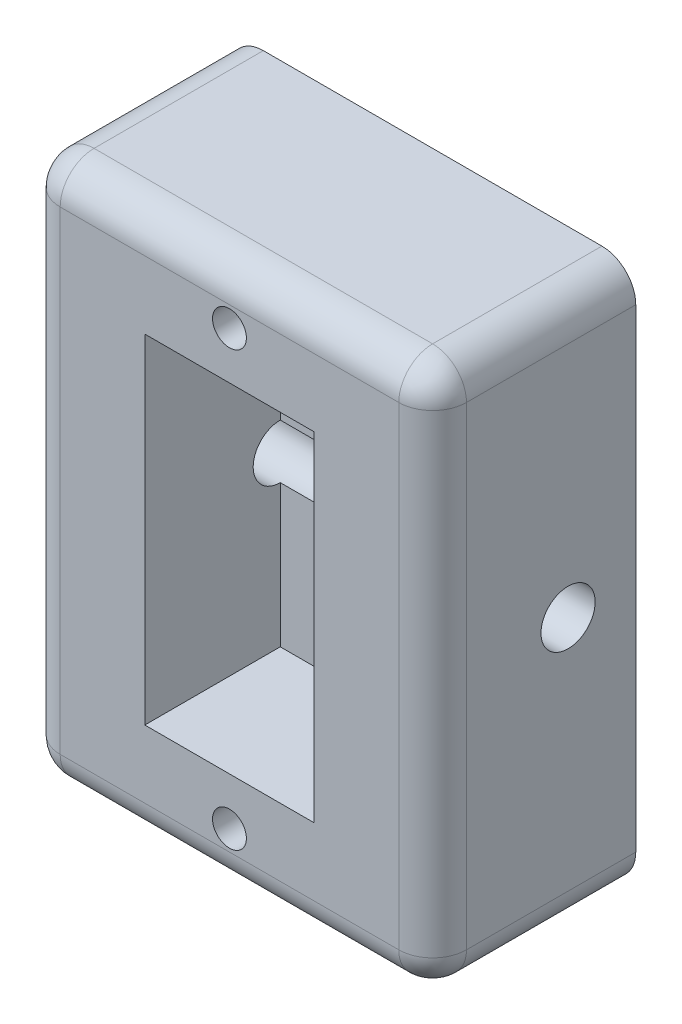
ISO-10303-21;
HEADER;
FILE_DESCRIPTION(('STEP AP214'),'2;1');
FILE_NAME('part.step','',(''),(''),'','','');
FILE_SCHEMA(('AUTOMOTIVE_DESIGN { 1 0 10303 214 1 1 1 1 }'));
ENDSEC;
DATA;
#1=APPLICATION_CONTEXT('core data for automotive mechanical design processes');
#2=APPLICATION_PROTOCOL_DEFINITION('international standard','automotive_design',2000,#1);
#3=PRODUCT_CONTEXT('',#1,'mechanical');
#4=PRODUCT('Part','Part','',(#3));
#5=PRODUCT_RELATED_PRODUCT_CATEGORY('part','',(#4));
#6=PRODUCT_DEFINITION_FORMATION('','',#4);
#7=PRODUCT_DEFINITION_CONTEXT('part definition',#1,'design');
#8=PRODUCT_DEFINITION('design','',#6,#7);
#9=PRODUCT_DEFINITION_SHAPE('','',#8);
#10=(LENGTH_UNIT() NAMED_UNIT(*) SI_UNIT(.MILLI.,.METRE.));
#11=(NAMED_UNIT(*) PLANE_ANGLE_UNIT() SI_UNIT($,.RADIAN.));
#12=(NAMED_UNIT(*) SI_UNIT($,.STERADIAN.) SOLID_ANGLE_UNIT());
#13=UNCERTAINTY_MEASURE_WITH_UNIT(LENGTH_MEASURE(1.E-05),#10,'distance_accuracy_value','');
#14=(GEOMETRIC_REPRESENTATION_CONTEXT(3) GLOBAL_UNCERTAINTY_ASSIGNED_CONTEXT((#13)) GLOBAL_UNIT_ASSIGNED_CONTEXT((#10,
#11,#12)) REPRESENTATION_CONTEXT('',''));
#15=CARTESIAN_POINT('',(0.,0.,0.));
#16=DIRECTION('',(0.,0.,1.));
#17=DIRECTION('',(1.,0.,0.));
#18=AXIS2_PLACEMENT_3D('',#15,#16,#17);
#19=CARTESIAN_POINT('',(0.,0.,-20.));
#20=DIRECTION('',(0.,0.,-1.));
#21=DIRECTION('',(-1.,0.,0.));
#22=AXIS2_PLACEMENT_3D('',#19,#20,#21);
#23=PLANE('',#22);
#24=DIRECTION('',(0.,-1.,0.));
#25=VECTOR('',#24,1.);
#26=CARTESIAN_POINT('',(-12.5,-25.,-20.));
#27=LINE('',#26,#25);
#28=CARTESIAN_POINT('',(-12.5,25.,-20.));
#29=VERTEX_POINT('',#28);
#30=CARTESIAN_POINT('',(-12.5,4.,-20.));
#31=VERTEX_POINT('',#30);
#32=EDGE_CURVE('E187',#29,#31,#27,.T.);
#33=ORIENTED_EDGE('',*,*,#32,.T.);
#34=DIRECTION('',(1.,0.,0.));
#35=VECTOR('',#34,1.);
#36=CARTESIAN_POINT('',(-30.,4.,-20.));
#37=LINE('',#36,#35);
#38=CARTESIAN_POINT('',(12.5,4.,-20.));
#39=VERTEX_POINT('',#38);
#40=EDGE_CURVE('E163',#31,#39,#37,.T.);
#41=ORIENTED_EDGE('',*,*,#40,.T.);
#42=DIRECTION('',(0.,1.,0.));
#43=VECTOR('',#42,1.);
#44=CARTESIAN_POINT('',(12.5,-25.,-20.));
#45=LINE('',#44,#43);
#46=CARTESIAN_POINT('',(12.5,25.,-20.));
#47=VERTEX_POINT('',#46);
#48=EDGE_CURVE('E173',#39,#47,#45,.T.);
#49=ORIENTED_EDGE('',*,*,#48,.T.);
#50=DIRECTION('',(-1.,0.,0.));
#51=VECTOR('',#50,1.);
#52=CARTESIAN_POINT('',(-12.5,25.,-20.));
#53=LINE('',#52,#51);
#54=EDGE_CURVE('E179',#47,#29,#53,.T.);
#55=ORIENTED_EDGE('',*,*,#54,.T.);
#56=EDGE_LOOP('',(#33,#41,#49,#55));
#57=FACE_BOUND('',#56,.T.);
#58=ADVANCED_FACE('F41',(#57),#23,.F.);
#59=CARTESIAN_POINT('',(30.,-40.,-30.));
#60=DIRECTION('',(1.,0.,0.));
#61=DIRECTION('',(0.,0.,-1.));
#62=AXIS2_PLACEMENT_3D('',#59,#60,#61);
#63=PLANE('',#62);
#64=DIRECTION('',(0.,1.,0.));
#65=VECTOR('',#64,1.);
#66=CARTESIAN_POINT('',(30.,-40.,-30.));
#67=LINE('',#66,#65);
#68=CARTESIAN_POINT('',(30.,-35.,-30.));
#69=VERTEX_POINT('',#68);
#70=CARTESIAN_POINT('',(30.,35.,-30.));
#71=VERTEX_POINT('',#70);
#72=EDGE_CURVE('E203',#69,#71,#67,.T.);
#73=ORIENTED_EDGE('',*,*,#72,.T.);
#74=DIRECTION('',(0.,0.,1.));
#75=VECTOR('',#74,1.);
#76=CARTESIAN_POINT('',(30.,35.,-30.));
#77=LINE('',#76,#75);
#78=CARTESIAN_POINT('',(30.,35.,-5.));
#79=VERTEX_POINT('',#78);
#80=EDGE_CURVE('E233',#71,#79,#77,.T.);
#81=ORIENTED_EDGE('',*,*,#80,.T.);
#82=DIRECTION('',(0.,1.,0.));
#83=VECTOR('',#82,1.);
#84=CARTESIAN_POINT('',(30.,-40.,-5.));
#85=LINE('',#84,#83);
#86=CARTESIAN_POINT('',(30.,-35.,-5.));
#87=VERTEX_POINT('',#86);
#88=EDGE_CURVE('E221',#79,#87,#85,.F.);
#89=ORIENTED_EDGE('',*,*,#88,.T.);
#90=DIRECTION('',(0.,0.,1.));
#91=VECTOR('',#90,1.);
#92=CARTESIAN_POINT('',(30.,-35.,-30.));
#93=LINE('',#92,#91);
#94=EDGE_CURVE('E231',#87,#69,#93,.F.);
#95=ORIENTED_EDGE('',*,*,#94,.T.);
#96=EDGE_LOOP('',(#73,#81,#89,#95));
#97=FACE_BOUND('',#96,.T.);
#98=CARTESIAN_POINT('',(30.,0.,-20.));
#99=DIRECTION('',(1.,0.,0.));
#100=DIRECTION('',(0.,0.,-1.));
#101=AXIS2_PLACEMENT_3D('',#98,#99,#100);
#102=CIRCLE('',#101,4.);
#103=CARTESIAN_POINT('',(30.,0.,-24.));
#104=VERTEX_POINT('',#103);
#105=EDGE_CURVE('E229',#104,#104,#102,.T.);
#106=ORIENTED_EDGE('',*,*,#105,.F.);
#107=EDGE_LOOP('',(#106));
#108=FACE_BOUND('',#107,.T.);
#109=ADVANCED_FACE('F343',(#97,#108),#63,.T.);
#110=CARTESIAN_POINT('',(-30.,-40.,-30.));
#111=DIRECTION('',(0.,-1.,0.));
#112=DIRECTION('',(1.,0.,0.));
#113=AXIS2_PLACEMENT_3D('',#110,#111,#112);
#114=PLANE('',#113);
#115=DIRECTION('',(1.,0.,0.));
#116=VECTOR('',#115,1.);
#117=CARTESIAN_POINT('',(-30.,-40.,-5.));
#118=LINE('',#117,#116);
#119=CARTESIAN_POINT('',(25.,-40.,-5.));
#120=VERTEX_POINT('',#119);
#121=CARTESIAN_POINT('',(-25.,-40.,-5.));
#122=VERTEX_POINT('',#121);
#123=EDGE_CURVE('E256',#120,#122,#118,.F.);
#124=ORIENTED_EDGE('',*,*,#123,.T.);
#125=DIRECTION('',(0.,0.,1.));
#126=VECTOR('',#125,1.);
#127=CARTESIAN_POINT('',(-25.,-40.,-30.));
#128=LINE('',#127,#126);
#129=CARTESIAN_POINT('',(-25.,-40.,-30.));
#130=VERTEX_POINT('',#129);
#131=EDGE_CURVE('E260',#122,#130,#128,.F.);
#132=ORIENTED_EDGE('',*,*,#131,.T.);
#133=DIRECTION('',(1.,0.,0.));
#134=VECTOR('',#133,1.);
#135=CARTESIAN_POINT('',(-30.,-40.,-30.));
#136=LINE('',#135,#134);
#137=CARTESIAN_POINT('',(25.,-40.,-30.));
#138=VERTEX_POINT('',#137);
#139=EDGE_CURVE('E164',#130,#138,#136,.T.);
#140=ORIENTED_EDGE('',*,*,#139,.T.);
#141=DIRECTION('',(0.,0.,1.));
#142=VECTOR('',#141,1.);
#143=CARTESIAN_POINT('',(25.,-40.,-30.));
#144=LINE('',#143,#142);
#145=EDGE_CURVE('E258',#138,#120,#144,.T.);
#146=ORIENTED_EDGE('',*,*,#145,.T.);
#147=EDGE_LOOP('',(#124,#132,#140,#146));
#148=FACE_BOUND('',#147,.T.);
#149=ADVANCED_FACE('F347',(#148),#114,.T.);
#150=CARTESIAN_POINT('',(-30.,-40.,-30.));
#151=DIRECTION('',(-1.,0.,0.));
#152=DIRECTION('',(0.,0.,1.));
#153=AXIS2_PLACEMENT_3D('',#150,#151,#152);
#154=PLANE('',#153);
#155=CARTESIAN_POINT('',(-30.,0.,-20.));
#156=DIRECTION('',(1.,0.,0.));
#157=DIRECTION('',(0.,0.,-1.));
#158=AXIS2_PLACEMENT_3D('',#155,#156,#157);
#159=CIRCLE('',#158,4.);
#160=CARTESIAN_POINT('',(-30.,0.,-24.));
#161=VERTEX_POINT('',#160);
#162=EDGE_CURVE('E314',#161,#161,#159,.T.);
#163=ORIENTED_EDGE('',*,*,#162,.T.);
#164=EDGE_LOOP('',(#163));
#165=FACE_BOUND('',#164,.T.);
#166=DIRECTION('',(0.,-1.,0.));
#167=VECTOR('',#166,1.);
#168=CARTESIAN_POINT('',(-30.,40.,-5.));
#169=LINE('',#168,#167);
#170=CARTESIAN_POINT('',(-30.,-35.,-5.));
#171=VERTEX_POINT('',#170);
#172=CARTESIAN_POINT('',(-30.,35.,-5.));
#173=VERTEX_POINT('',#172);
#174=EDGE_CURVE('E250',#171,#173,#169,.F.);
#175=ORIENTED_EDGE('',*,*,#174,.T.);
#176=DIRECTION('',(0.,0.,1.));
#177=VECTOR('',#176,1.);
#178=CARTESIAN_POINT('',(-30.,35.,-30.));
#179=LINE('',#178,#177);
#180=CARTESIAN_POINT('',(-30.,35.,-30.));
#181=VERTEX_POINT('',#180);
#182=EDGE_CURVE('E254',#173,#181,#179,.F.);
#183=ORIENTED_EDGE('',*,*,#182,.T.);
#184=DIRECTION('',(0.,-1.,0.));
#185=VECTOR('',#184,1.);
#186=CARTESIAN_POINT('',(-30.,-40.,-30.));
#187=LINE('',#186,#185);
#188=CARTESIAN_POINT('',(-30.,-35.,-30.));
#189=VERTEX_POINT('',#188);
#190=EDGE_CURVE('E215',#181,#189,#187,.T.);
#191=ORIENTED_EDGE('',*,*,#190,.T.);
#192=DIRECTION('',(0.,0.,1.));
#193=VECTOR('',#192,1.);
#194=CARTESIAN_POINT('',(-30.,-35.,-30.));
#195=LINE('',#194,#193);
#196=EDGE_CURVE('E252',#189,#171,#195,.T.);
#197=ORIENTED_EDGE('',*,*,#196,.T.);
#198=EDGE_LOOP('',(#175,#183,#191,#197));
#199=FACE_BOUND('',#198,.T.);
#200=ADVANCED_FACE('F370',(#165,#199),#154,.T.);
#201=CARTESIAN_POINT('',(-30.,40.,-30.));
#202=DIRECTION('',(0.,1.,0.));
#203=DIRECTION('',(0.,0.,1.));
#204=AXIS2_PLACEMENT_3D('',#201,#202,#203);
#205=PLANE('',#204);
#206=DIRECTION('',(-1.,0.,0.));
#207=VECTOR('',#206,1.);
#208=CARTESIAN_POINT('',(30.,40.,-5.));
#209=LINE('',#208,#207);
#210=CARTESIAN_POINT('',(-25.,40.,-5.));
#211=VERTEX_POINT('',#210);
#212=CARTESIAN_POINT('',(25.,40.,-5.));
#213=VERTEX_POINT('',#212);
#214=EDGE_CURVE('E236',#211,#213,#209,.F.);
#215=ORIENTED_EDGE('',*,*,#214,.T.);
#216=DIRECTION('',(0.,0.,1.));
#217=VECTOR('',#216,1.);
#218=CARTESIAN_POINT('',(25.,40.,-30.));
#219=LINE('',#218,#217);
#220=CARTESIAN_POINT('',(25.,40.,-30.));
#221=VERTEX_POINT('',#220);
#222=EDGE_CURVE('E240',#213,#221,#219,.F.);
#223=ORIENTED_EDGE('',*,*,#222,.T.);
#224=DIRECTION('',(-1.,0.,0.));
#225=VECTOR('',#224,1.);
#226=CARTESIAN_POINT('',(-30.,40.,-30.));
#227=LINE('',#226,#225);
#228=CARTESIAN_POINT('',(-25.,40.,-30.));
#229=VERTEX_POINT('',#228);
#230=EDGE_CURVE('E212',#221,#229,#227,.T.);
#231=ORIENTED_EDGE('',*,*,#230,.T.);
#232=DIRECTION('',(0.,0.,1.));
#233=VECTOR('',#232,1.);
#234=CARTESIAN_POINT('',(-25.,40.,-30.));
#235=LINE('',#234,#233);
#236=EDGE_CURVE('E238',#229,#211,#235,.T.);
#237=ORIENTED_EDGE('',*,*,#236,.T.);
#238=EDGE_LOOP('',(#215,#223,#231,#237));
#239=FACE_BOUND('',#238,.T.);
#240=ADVANCED_FACE('F364',(#239),#205,.T.);
#241=CARTESIAN_POINT('',(0.,0.,-30.));
#242=DIRECTION('',(0.,0.,-1.));
#243=DIRECTION('',(-1.,0.,0.));
#244=AXIS2_PLACEMENT_3D('',#241,#242,#243);
#245=PLANE('',#244);
#246=ORIENTED_EDGE('',*,*,#230,.F.);
#247=CARTESIAN_POINT('',(25.,35.,-30.));
#248=DIRECTION('',(0.,0.,-1.));
#249=DIRECTION('',(-1.,0.,0.));
#250=AXIS2_PLACEMENT_3D('',#247,#248,#249);
#251=CIRCLE('',#250,5.);
#252=EDGE_CURVE('E248',#221,#71,#251,.T.);
#253=ORIENTED_EDGE('',*,*,#252,.T.);
#254=ORIENTED_EDGE('',*,*,#72,.F.);
#255=CARTESIAN_POINT('',(25.,-35.,-30.));
#256=DIRECTION('',(0.,0.,-1.));
#257=DIRECTION('',(-1.,0.,0.));
#258=AXIS2_PLACEMENT_3D('',#255,#256,#257);
#259=CIRCLE('',#258,5.);
#260=EDGE_CURVE('E242',#69,#138,#259,.T.);
#261=ORIENTED_EDGE('',*,*,#260,.T.);
#262=ORIENTED_EDGE('',*,*,#139,.F.);
#263=CARTESIAN_POINT('',(-25.,-35.,-30.));
#264=DIRECTION('',(0.,0.,-1.));
#265=DIRECTION('',(-1.,0.,0.));
#266=AXIS2_PLACEMENT_3D('',#263,#264,#265);
#267=CIRCLE('',#266,5.);
#268=EDGE_CURVE('E244',#130,#189,#267,.T.);
#269=ORIENTED_EDGE('',*,*,#268,.T.);
#270=ORIENTED_EDGE('',*,*,#190,.F.);
#271=CARTESIAN_POINT('',(-25.,35.,-30.));
#272=DIRECTION('',(0.,0.,-1.));
#273=DIRECTION('',(-1.,0.,0.));
#274=AXIS2_PLACEMENT_3D('',#271,#272,#273);
#275=CIRCLE('',#274,5.);
#276=EDGE_CURVE('E246',#181,#229,#275,.T.);
#277=ORIENTED_EDGE('',*,*,#276,.T.);
#278=EDGE_LOOP('',(#246,#253,#254,#261,#262,#269,#270,#277));
#279=FACE_BOUND('',#278,.T.);
#280=ADVANCED_FACE('F361',(#279),#245,.T.);
#281=CARTESIAN_POINT('',(0.,0.,0.));
#282=DIRECTION('',(0.,0.,-1.));
#283=DIRECTION('',(-1.,0.,0.));
#284=AXIS2_PLACEMENT_3D('',#281,#282,#283);
#285=PLANE('',#284);
#286=DIRECTION('',(0.,-1.,0.));
#287=VECTOR('',#286,1.);
#288=CARTESIAN_POINT('',(-25.,-40.,0.));
#289=LINE('',#288,#287);
#290=CARTESIAN_POINT('',(-25.,35.,0.));
#291=VERTEX_POINT('',#290);
#292=CARTESIAN_POINT('',(-25.,-35.,0.));
#293=VERTEX_POINT('',#292);
#294=EDGE_CURVE('E262',#291,#293,#289,.T.);
#295=ORIENTED_EDGE('',*,*,#294,.T.);
#296=DIRECTION('',(1.,0.,0.));
#297=VECTOR('',#296,1.);
#298=CARTESIAN_POINT('',(30.,-35.,0.));
#299=LINE('',#298,#297);
#300=CARTESIAN_POINT('',(25.,-35.,0.));
#301=VERTEX_POINT('',#300);
#302=EDGE_CURVE('E11',#293,#301,#299,.T.);
#303=ORIENTED_EDGE('',*,*,#302,.T.);
#304=DIRECTION('',(0.,1.,0.));
#305=VECTOR('',#304,1.);
#306=CARTESIAN_POINT('',(25.,40.,0.));
#307=LINE('',#306,#305);
#308=CARTESIAN_POINT('',(25.,35.,0.));
#309=VERTEX_POINT('',#308);
#310=EDGE_CURVE('E50',#301,#309,#307,.T.);
#311=ORIENTED_EDGE('',*,*,#310,.T.);
#312=DIRECTION('',(-1.,0.,0.));
#313=VECTOR('',#312,1.);
#314=CARTESIAN_POINT('',(-30.,35.,0.));
#315=LINE('',#314,#313);
#316=EDGE_CURVE('E264',#309,#291,#315,.T.);
#317=ORIENTED_EDGE('',*,*,#316,.T.);
#318=EDGE_LOOP('',(#295,#303,#311,#317));
#319=FACE_BOUND('',#318,.T.);
#320=CARTESIAN_POINT('',(0.,32.,0.));
#321=DIRECTION('',(0.,0.,-1.));
#322=DIRECTION('',(-1.,0.,0.));
#323=AXIS2_PLACEMENT_3D('',#320,#321,#322);
#324=CIRCLE('',#323,2.5);
#325=CARTESIAN_POINT('',(-2.5,32.,0.));
#326=VERTEX_POINT('',#325);
#327=EDGE_CURVE('E225',#326,#326,#324,.F.);
#328=ORIENTED_EDGE('',*,*,#327,.F.);
#329=EDGE_LOOP('',(#328));
#330=FACE_BOUND('',#329,.T.);
#331=CARTESIAN_POINT('',(0.,-32.,0.));
#332=DIRECTION('',(0.,0.,-1.));
#333=DIRECTION('',(-1.,0.,0.));
#334=AXIS2_PLACEMENT_3D('',#331,#332,#333);
#335=CIRCLE('',#334,2.5);
#336=CARTESIAN_POINT('',(-2.5,-32.,0.));
#337=VERTEX_POINT('',#336);
#338=EDGE_CURVE('E222',#337,#337,#335,.F.);
#339=ORIENTED_EDGE('',*,*,#338,.F.);
#340=EDGE_LOOP('',(#339));
#341=FACE_BOUND('',#340,.T.);
#342=DIRECTION('',(-1.,0.,0.));
#343=VECTOR('',#342,1.);
#344=CARTESIAN_POINT('',(-12.5,25.,0.));
#345=LINE('',#344,#343);
#346=CARTESIAN_POINT('',(12.5,25.,0.));
#347=VERTEX_POINT('',#346);
#348=CARTESIAN_POINT('',(-12.5,25.,0.));
#349=VERTEX_POINT('',#348);
#350=EDGE_CURVE('E193',#347,#349,#345,.T.);
#351=ORIENTED_EDGE('',*,*,#350,.F.);
#352=DIRECTION('',(0.,1.,0.));
#353=VECTOR('',#352,1.);
#354=CARTESIAN_POINT('',(12.5,-25.,0.));
#355=LINE('',#354,#353);
#356=CARTESIAN_POINT('',(12.5,-25.,0.));
#357=VERTEX_POINT('',#356);
#358=EDGE_CURVE('E174',#357,#347,#355,.T.);
#359=ORIENTED_EDGE('',*,*,#358,.F.);
#360=DIRECTION('',(1.,0.,0.));
#361=VECTOR('',#360,1.);
#362=CARTESIAN_POINT('',(-12.5,-25.,0.));
#363=LINE('',#362,#361);
#364=CARTESIAN_POINT('',(-12.5,-25.,0.));
#365=VERTEX_POINT('',#364);
#366=EDGE_CURVE('E184',#365,#357,#363,.T.);
#367=ORIENTED_EDGE('',*,*,#366,.F.);
#368=DIRECTION('',(0.,-1.,0.));
#369=VECTOR('',#368,1.);
#370=CARTESIAN_POINT('',(-12.5,-25.,0.));
#371=LINE('',#370,#369);
#372=EDGE_CURVE('E196',#349,#365,#371,.T.);
#373=ORIENTED_EDGE('',*,*,#372,.F.);
#374=EDGE_LOOP('',(#351,#359,#367,#373));
#375=FACE_BOUND('',#374,.T.);
#376=ADVANCED_FACE('F329',(#319,#330,#341,#375),#285,.F.);
#377=CARTESIAN_POINT('',(12.5,-25.,-20.));
#378=DIRECTION('',(1.,0.,0.));
#379=DIRECTION('',(0.,0.,-1.));
#380=AXIS2_PLACEMENT_3D('',#377,#378,#379);
#381=PLANE('',#380);
#382=ORIENTED_EDGE('',*,*,#48,.F.);
#383=CARTESIAN_POINT('',(12.5,0.,-20.));
#384=DIRECTION('',(1.,0.,0.));
#385=DIRECTION('',(0.,0.,-1.));
#386=AXIS2_PLACEMENT_3D('',#383,#384,#385);
#387=CIRCLE('',#386,4.);
#388=CARTESIAN_POINT('',(12.5,-3.99999999999999,-20.));
#389=VERTEX_POINT('',#388);
#390=EDGE_CURVE('E156',#39,#389,#387,.T.);
#391=ORIENTED_EDGE('',*,*,#390,.T.);
#392=CARTESIAN_POINT('',(12.5,-25.,-20.));
#393=VERTEX_POINT('',#392);
#394=EDGE_CURVE('E170',#393,#389,#45,.T.);
#395=ORIENTED_EDGE('',*,*,#394,.F.);
#396=DIRECTION('',(0.,0.,1.));
#397=VECTOR('',#396,1.);
#398=CARTESIAN_POINT('',(12.5,-25.,-20.));
#399=LINE('',#398,#397);
#400=EDGE_CURVE('E201',#393,#357,#399,.T.);
#401=ORIENTED_EDGE('',*,*,#400,.T.);
#402=ORIENTED_EDGE('',*,*,#358,.T.);
#403=DIRECTION('',(0.,0.,1.));
#404=VECTOR('',#403,1.);
#405=CARTESIAN_POINT('',(12.5,25.,-20.));
#406=LINE('',#405,#404);
#407=EDGE_CURVE('E191',#47,#347,#406,.T.);
#408=ORIENTED_EDGE('',*,*,#407,.F.);
#409=EDGE_LOOP('',(#382,#391,#395,#401,#402,#408));
#410=FACE_BOUND('',#409,.T.);
#411=ADVANCED_FACE('F169',(#410),#381,.F.);
#412=CARTESIAN_POINT('',(-12.5,-25.,-20.));
#413=DIRECTION('',(0.,-1.,0.));
#414=DIRECTION('',(1.,0.,0.));
#415=AXIS2_PLACEMENT_3D('',#412,#413,#414);
#416=PLANE('',#415);
#417=ORIENTED_EDGE('',*,*,#366,.T.);
#418=ORIENTED_EDGE('',*,*,#400,.F.);
#419=DIRECTION('',(1.,0.,0.));
#420=VECTOR('',#419,1.);
#421=CARTESIAN_POINT('',(-12.5,-25.,-20.));
#422=LINE('',#421,#420);
#423=CARTESIAN_POINT('',(-12.5,-25.,-20.));
#424=VERTEX_POINT('',#423);
#425=EDGE_CURVE('E178',#424,#393,#422,.T.);
#426=ORIENTED_EDGE('',*,*,#425,.F.);
#427=DIRECTION('',(0.,0.,1.));
#428=VECTOR('',#427,1.);
#429=CARTESIAN_POINT('',(-12.5,-25.,-20.));
#430=LINE('',#429,#428);
#431=EDGE_CURVE('E204',#424,#365,#430,.T.);
#432=ORIENTED_EDGE('',*,*,#431,.T.);
#433=EDGE_LOOP('',(#417,#418,#426,#432));
#434=FACE_BOUND('',#433,.T.);
#435=ADVANCED_FACE('F331',(#434),#416,.F.);
#436=CARTESIAN_POINT('',(-12.5,-25.,-20.));
#437=DIRECTION('',(-1.,0.,0.));
#438=DIRECTION('',(0.,0.,1.));
#439=AXIS2_PLACEMENT_3D('',#436,#437,#438);
#440=PLANE('',#439);
#441=CARTESIAN_POINT('',(-12.5,-3.99999999999999,-20.));
#442=VERTEX_POINT('',#441);
#443=EDGE_CURVE('E182',#442,#424,#27,.T.);
#444=ORIENTED_EDGE('',*,*,#443,.F.);
#445=CARTESIAN_POINT('',(-12.5,0.,-20.));
#446=DIRECTION('',(-1.,0.,0.));
#447=DIRECTION('',(0.,0.,1.));
#448=AXIS2_PLACEMENT_3D('',#445,#446,#447);
#449=CIRCLE('',#448,4.);
#450=EDGE_CURVE('E159',#442,#31,#449,.T.);
#451=ORIENTED_EDGE('',*,*,#450,.T.);
#452=ORIENTED_EDGE('',*,*,#32,.F.);
#453=DIRECTION('',(0.,0.,1.));
#454=VECTOR('',#453,1.);
#455=CARTESIAN_POINT('',(-12.5,25.,-20.));
#456=LINE('',#455,#454);
#457=EDGE_CURVE('E206',#29,#349,#456,.T.);
#458=ORIENTED_EDGE('',*,*,#457,.T.);
#459=ORIENTED_EDGE('',*,*,#372,.T.);
#460=ORIENTED_EDGE('',*,*,#431,.F.);
#461=EDGE_LOOP('',(#444,#451,#452,#458,#459,#460));
#462=FACE_BOUND('',#461,.T.);
#463=ADVANCED_FACE('F318',(#462),#440,.F.);
#464=CARTESIAN_POINT('',(-12.5,25.,-20.));
#465=DIRECTION('',(0.,1.,0.));
#466=DIRECTION('',(0.,0.,1.));
#467=AXIS2_PLACEMENT_3D('',#464,#465,#466);
#468=PLANE('',#467);
#469=ORIENTED_EDGE('',*,*,#350,.T.);
#470=ORIENTED_EDGE('',*,*,#457,.F.);
#471=ORIENTED_EDGE('',*,*,#54,.F.);
#472=ORIENTED_EDGE('',*,*,#407,.T.);
#473=EDGE_LOOP('',(#469,#470,#471,#472));
#474=FACE_BOUND('',#473,.T.);
#475=ADVANCED_FACE('F323',(#474),#468,.F.);
#476=ORIENTED_EDGE('',*,*,#394,.T.);
#477=DIRECTION('',(1.,0.,0.));
#478=VECTOR('',#477,1.);
#479=CARTESIAN_POINT('',(-30.,-3.99999999999999,-20.));
#480=LINE('',#479,#478);
#481=EDGE_CURVE('E153',#389,#442,#480,.F.);
#482=ORIENTED_EDGE('',*,*,#481,.T.);
#483=ORIENTED_EDGE('',*,*,#443,.T.);
#484=ORIENTED_EDGE('',*,*,#425,.T.);
#485=EDGE_LOOP('',(#476,#482,#483,#484));
#486=FACE_BOUND('',#485,.T.);
#487=ADVANCED_FACE('F176',(#486),#23,.F.);
#488=CARTESIAN_POINT('',(-30.,0.,-20.));
#489=DIRECTION('',(1.,0.,0.));
#490=DIRECTION('',(0.,0.,-1.));
#491=AXIS2_PLACEMENT_3D('',#488,#489,#490);
#492=CYLINDRICAL_SURFACE('',#491,4.);
#493=ORIENTED_EDGE('',*,*,#162,.F.);
#494=EDGE_LOOP('',(#493));
#495=FACE_BOUND('',#494,.T.);
#496=ORIENTED_EDGE('',*,*,#105,.T.);
#497=EDGE_LOOP('',(#496));
#498=FACE_BOUND('',#497,.T.);
#499=ORIENTED_EDGE('',*,*,#450,.F.);
#500=ORIENTED_EDGE('',*,*,#481,.F.);
#501=ORIENTED_EDGE('',*,*,#390,.F.);
#502=ORIENTED_EDGE('',*,*,#40,.F.);
#503=EDGE_LOOP('',(#499,#500,#501,#502));
#504=FACE_BOUND('',#503,.T.);
#505=ADVANCED_FACE('F155',(#495,#498,#504),#492,.F.);
#506=CARTESIAN_POINT('',(0.,-32.,1.2E-05));
#507=DIRECTION('',(0.,0.,-1.));
#508=DIRECTION('',(-1.,0.,0.));
#509=AXIS2_PLACEMENT_3D('',#506,#507,#508);
#510=CYLINDRICAL_SURFACE('',#509,2.5);
#511=CARTESIAN_POINT('',(0.,-32.,-29.));
#512=DIRECTION('',(0.,0.,1.));
#513=DIRECTION('',(1.,0.,0.));
#514=AXIS2_PLACEMENT_3D('',#511,#512,#513);
#515=CIRCLE('',#514,2.5);
#516=CARTESIAN_POINT('',(-2.5,-32.,-29.));
#517=VERTEX_POINT('',#516);
#518=EDGE_CURVE('E301',#517,#517,#515,.T.);
#519=CARTESIAN_POINT('',(-2.5,-32.,-29.));
#520=CARTESIAN_POINT('',(-2.5,-32.,-28.6979166666667));
#521=CARTESIAN_POINT('',(-2.5,-32.,-28.3958333333333));
#522=CARTESIAN_POINT('',(-2.5,-32.,-27.7916666666667));
#523=CARTESIAN_POINT('',(-2.5,-32.,-27.4895833333333));
#524=CARTESIAN_POINT('',(-2.5,-32.,-26.8854166666667));
#525=CARTESIAN_POINT('',(-2.5,-32.,-26.5833333333333));
#526=CARTESIAN_POINT('',(-2.5,-32.,-25.9791666666667));
#527=CARTESIAN_POINT('',(-2.5,-32.,-25.6770833333333));
#528=CARTESIAN_POINT('',(-2.5,-32.,-25.0729166666667));
#529=CARTESIAN_POINT('',(-2.5,-32.,-24.7708333333333));
#530=CARTESIAN_POINT('',(-2.5,-32.,-24.1666666666667));
#531=CARTESIAN_POINT('',(-2.5,-32.,-23.8645833333333));
#532=CARTESIAN_POINT('',(-2.5,-32.,-23.2604166666667));
#533=CARTESIAN_POINT('',(-2.5,-32.,-22.9583333333333));
#534=CARTESIAN_POINT('',(-2.5,-32.,-22.3541666666667));
#535=CARTESIAN_POINT('',(-2.5,-32.,-22.0520833333333));
#536=CARTESIAN_POINT('',(-2.5,-32.,-21.4479166666667));
#537=CARTESIAN_POINT('',(-2.5,-32.,-21.1458333333333));
#538=CARTESIAN_POINT('',(-2.5,-32.,-20.5416666666667));
#539=CARTESIAN_POINT('',(-2.5,-32.,-20.2395833333333));
#540=CARTESIAN_POINT('',(-2.5,-32.,-19.6354166666667));
#541=CARTESIAN_POINT('',(-2.5,-32.,-19.3333333333333));
#542=CARTESIAN_POINT('',(-2.5,-32.,-18.7291666666667));
#543=CARTESIAN_POINT('',(-2.5,-32.,-18.4270833333333));
#544=CARTESIAN_POINT('',(-2.5,-32.,-17.8229166666667));
#545=CARTESIAN_POINT('',(-2.5,-32.,-17.5208333333333));
#546=CARTESIAN_POINT('',(-2.5,-32.,-16.9166666666667));
#547=CARTESIAN_POINT('',(-2.5,-32.,-16.6145833333333));
#548=CARTESIAN_POINT('',(-2.5,-32.,-16.0104166666667));
#549=CARTESIAN_POINT('',(-2.5,-32.,-15.7083333333333));
#550=CARTESIAN_POINT('',(-2.5,-32.,-15.1041666666667));
#551=CARTESIAN_POINT('',(-2.5,-32.,-14.8020833333333));
#552=CARTESIAN_POINT('',(-2.5,-32.,-14.1979166666667));
#553=CARTESIAN_POINT('',(-2.5,-32.,-13.8958333333333));
#554=CARTESIAN_POINT('',(-2.5,-32.,-13.2916666666667));
#555=CARTESIAN_POINT('',(-2.5,-32.,-12.9895833333333));
#556=CARTESIAN_POINT('',(-2.5,-32.,-12.3854166666667));
#557=CARTESIAN_POINT('',(-2.5,-32.,-12.0833333333333));
#558=CARTESIAN_POINT('',(-2.5,-32.,-11.4791666666667));
#559=CARTESIAN_POINT('',(-2.5,-32.,-11.1770833333333));
#560=CARTESIAN_POINT('',(-2.5,-32.,-10.5729166666667));
#561=CARTESIAN_POINT('',(-2.5,-32.,-10.2708333333333));
#562=CARTESIAN_POINT('',(-2.5,-32.,-9.66666666666667));
#563=CARTESIAN_POINT('',(-2.5,-32.,-9.36458333333333));
#564=CARTESIAN_POINT('',(-2.5,-32.,-8.76041666666667));
#565=CARTESIAN_POINT('',(-2.5,-32.,-8.45833333333333));
#566=CARTESIAN_POINT('',(-2.5,-32.,-7.85416666666667));
#567=CARTESIAN_POINT('',(-2.5,-32.,-7.55208333333333));
#568=CARTESIAN_POINT('',(-2.5,-32.,-6.94791666666667));
#569=CARTESIAN_POINT('',(-2.5,-32.,-6.64583333333333));
#570=CARTESIAN_POINT('',(-2.5,-32.,-6.04166666666667));
#571=CARTESIAN_POINT('',(-2.5,-32.,-5.73958333333333));
#572=CARTESIAN_POINT('',(-2.5,-32.,-5.13541666666667));
#573=CARTESIAN_POINT('',(-2.5,-32.,-4.83333333333333));
#574=CARTESIAN_POINT('',(-2.5,-32.,-4.22916666666667));
#575=CARTESIAN_POINT('',(-2.5,-32.,-3.92708333333333));
#576=CARTESIAN_POINT('',(-2.5,-32.,-3.32291666666667));
#577=CARTESIAN_POINT('',(-2.5,-32.,-3.02083333333333));
#578=CARTESIAN_POINT('',(-2.5,-32.,-2.41666666666667));
#579=CARTESIAN_POINT('',(-2.5,-32.,-2.11458333333333));
#580=CARTESIAN_POINT('',(-2.5,-32.,-1.51041666666667));
#581=CARTESIAN_POINT('',(-2.5,-32.,-1.20833333333333));
#582=CARTESIAN_POINT('',(-2.5,-32.,-0.604166666666668));
#583=CARTESIAN_POINT('',(-2.5,-32.,-0.302083333333335));
#584=CARTESIAN_POINT('',(-2.5,-32.,0.));
#585=B_SPLINE_CURVE_WITH_KNOTS('',3,(#519,#520,#521,#522,#523,#524,#525,#526,#527,#528,#529,
#530,#531,#532,#533,#534,#535,#536,#537,#538,#539,#540,#541,#542,#543,#544,#545,#546,#547,#548,
#549,#550,#551,#552,#553,#554,#555,#556,#557,#558,#559,#560,#561,#562,#563,#564,#565,#566,#567,
#568,#569,#570,#571,#572,#573,#574,#575,#576,#577,#578,#579,#580,#581,#582,#583,#584),
.UNSPECIFIED.,.F.,.F.,(4,2,2,2,2,2,2,2,2,2,2,2,2,2,2,2,2,2,2,2,2,2,2,2,2,2,2,2,2,2,2,2,4),(0.,
0.906250000000001,1.8125,2.71875,3.625,4.53125,5.4375,6.34375,7.25,8.15625,9.0625,9.96875,
10.875,11.78125,12.6875,13.59375,14.5,15.40625,16.3125,17.21875,18.125,19.03125,19.9375,
20.84375,21.75,22.65625,23.5625,24.46875,25.375,26.28125,27.1875,28.09375,29.),.UNSPECIFIED.);
#586=EDGE_CURVE('BSEAM355',#517,#337,#585,.T.);
#587=ORIENTED_EDGE('',*,*,#518,.F.);
#588=ORIENTED_EDGE('',*,*,#338,.T.);
#589=ORIENTED_EDGE('',*,*,#586,.T.);
#590=ORIENTED_EDGE('',*,*,#586,.F.);
#591=EDGE_LOOP('',(#587,#589,#588,#590));
#592=FACE_BOUND('',#591,.T.);
#593=ADVANCED_FACE('F355',(#592),#510,.F.);
#594=CARTESIAN_POINT('',(0.,-32.,-29.));
#595=DIRECTION('',(0.,0.,1.));
#596=DIRECTION('',(1.,0.,0.));
#597=AXIS2_PLACEMENT_3D('',#594,#595,#596);
#598=PLANE('',#597);
#599=ORIENTED_EDGE('',*,*,#518,.T.);
#600=EDGE_LOOP('',(#599));
#601=FACE_BOUND('',#600,.T.);
#602=ADVANCED_FACE('F456',(#601),#598,.T.);
#603=CARTESIAN_POINT('',(0.,32.,1.2E-05));
#604=DIRECTION('',(0.,0.,-1.));
#605=DIRECTION('',(-1.,0.,0.));
#606=AXIS2_PLACEMENT_3D('',#603,#604,#605);
#607=CYLINDRICAL_SURFACE('',#606,2.5);
#608=CARTESIAN_POINT('',(0.,32.,-29.));
#609=DIRECTION('',(0.,0.,1.));
#610=DIRECTION('',(1.,0.,0.));
#611=AXIS2_PLACEMENT_3D('',#608,#609,#610);
#612=CIRCLE('',#611,2.5);
#613=CARTESIAN_POINT('',(-2.5,32.,-29.));
#614=VERTEX_POINT('',#613);
#615=EDGE_CURVE('E226',#614,#614,#612,.T.);
#616=CARTESIAN_POINT('',(-2.5,32.,-29.));
#617=CARTESIAN_POINT('',(-2.5,32.,-28.6979166666667));
#618=CARTESIAN_POINT('',(-2.5,32.,-28.3958333333333));
#619=CARTESIAN_POINT('',(-2.5,32.,-27.7916666666667));
#620=CARTESIAN_POINT('',(-2.5,32.,-27.4895833333333));
#621=CARTESIAN_POINT('',(-2.5,32.,-26.8854166666667));
#622=CARTESIAN_POINT('',(-2.5,32.,-26.5833333333333));
#623=CARTESIAN_POINT('',(-2.5,32.,-25.9791666666667));
#624=CARTESIAN_POINT('',(-2.5,32.,-25.6770833333333));
#625=CARTESIAN_POINT('',(-2.5,32.,-25.0729166666667));
#626=CARTESIAN_POINT('',(-2.5,32.,-24.7708333333333));
#627=CARTESIAN_POINT('',(-2.5,32.,-24.1666666666667));
#628=CARTESIAN_POINT('',(-2.5,32.,-23.8645833333333));
#629=CARTESIAN_POINT('',(-2.5,32.,-23.2604166666667));
#630=CARTESIAN_POINT('',(-2.5,32.,-22.9583333333333));
#631=CARTESIAN_POINT('',(-2.5,32.,-22.3541666666667));
#632=CARTESIAN_POINT('',(-2.5,32.,-22.0520833333333));
#633=CARTESIAN_POINT('',(-2.5,32.,-21.4479166666667));
#634=CARTESIAN_POINT('',(-2.5,32.,-21.1458333333333));
#635=CARTESIAN_POINT('',(-2.5,32.,-20.5416666666667));
#636=CARTESIAN_POINT('',(-2.5,32.,-20.2395833333333));
#637=CARTESIAN_POINT('',(-2.5,32.,-19.6354166666667));
#638=CARTESIAN_POINT('',(-2.5,32.,-19.3333333333333));
#639=CARTESIAN_POINT('',(-2.5,32.,-18.7291666666667));
#640=CARTESIAN_POINT('',(-2.5,32.,-18.4270833333333));
#641=CARTESIAN_POINT('',(-2.5,32.,-17.8229166666667));
#642=CARTESIAN_POINT('',(-2.5,32.,-17.5208333333333));
#643=CARTESIAN_POINT('',(-2.5,32.,-16.9166666666667));
#644=CARTESIAN_POINT('',(-2.5,32.,-16.6145833333333));
#645=CARTESIAN_POINT('',(-2.5,32.,-16.0104166666667));
#646=CARTESIAN_POINT('',(-2.5,32.,-15.7083333333333));
#647=CARTESIAN_POINT('',(-2.5,32.,-15.1041666666667));
#648=CARTESIAN_POINT('',(-2.5,32.,-14.8020833333333));
#649=CARTESIAN_POINT('',(-2.5,32.,-14.1979166666667));
#650=CARTESIAN_POINT('',(-2.5,32.,-13.8958333333333));
#651=CARTESIAN_POINT('',(-2.5,32.,-13.2916666666667));
#652=CARTESIAN_POINT('',(-2.5,32.,-12.9895833333333));
#653=CARTESIAN_POINT('',(-2.5,32.,-12.3854166666667));
#654=CARTESIAN_POINT('',(-2.5,32.,-12.0833333333333));
#655=CARTESIAN_POINT('',(-2.5,32.,-11.4791666666667));
#656=CARTESIAN_POINT('',(-2.5,32.,-11.1770833333333));
#657=CARTESIAN_POINT('',(-2.5,32.,-10.5729166666667));
#658=CARTESIAN_POINT('',(-2.5,32.,-10.2708333333333));
#659=CARTESIAN_POINT('',(-2.5,32.,-9.66666666666667));
#660=CARTESIAN_POINT('',(-2.5,32.,-9.36458333333333));
#661=CARTESIAN_POINT('',(-2.5,32.,-8.76041666666667));
#662=CARTESIAN_POINT('',(-2.5,32.,-8.45833333333333));
#663=CARTESIAN_POINT('',(-2.5,32.,-7.85416666666667));
#664=CARTESIAN_POINT('',(-2.5,32.,-7.55208333333333));
#665=CARTESIAN_POINT('',(-2.5,32.,-6.94791666666667));
#666=CARTESIAN_POINT('',(-2.5,32.,-6.64583333333333));
#667=CARTESIAN_POINT('',(-2.5,32.,-6.04166666666667));
#668=CARTESIAN_POINT('',(-2.5,32.,-5.73958333333333));
#669=CARTESIAN_POINT('',(-2.5,32.,-5.13541666666667));
#670=CARTESIAN_POINT('',(-2.5,32.,-4.83333333333333));
#671=CARTESIAN_POINT('',(-2.5,32.,-4.22916666666667));
#672=CARTESIAN_POINT('',(-2.5,32.,-3.92708333333333));
#673=CARTESIAN_POINT('',(-2.5,32.,-3.32291666666667));
#674=CARTESIAN_POINT('',(-2.5,32.,-3.02083333333333));
#675=CARTESIAN_POINT('',(-2.5,32.,-2.41666666666667));
#676=CARTESIAN_POINT('',(-2.5,32.,-2.11458333333333));
#677=CARTESIAN_POINT('',(-2.5,32.,-1.51041666666667));
#678=CARTESIAN_POINT('',(-2.5,32.,-1.20833333333333));
#679=CARTESIAN_POINT('',(-2.5,32.,-0.604166666666668));
#680=CARTESIAN_POINT('',(-2.5,32.,-0.302083333333335));
#681=CARTESIAN_POINT('',(-2.5,32.,0.));
#682=B_SPLINE_CURVE_WITH_KNOTS('',3,(#616,#617,#618,#619,#620,#621,#622,#623,#624,#625,#626,
#627,#628,#629,#630,#631,#632,#633,#634,#635,#636,#637,#638,#639,#640,#641,#642,#643,#644,#645,
#646,#647,#648,#649,#650,#651,#652,#653,#654,#655,#656,#657,#658,#659,#660,#661,#662,#663,#664,
#665,#666,#667,#668,#669,#670,#671,#672,#673,#674,#675,#676,#677,#678,#679,#680,#681),
.UNSPECIFIED.,.F.,.F.,(4,2,2,2,2,2,2,2,2,2,2,2,2,2,2,2,2,2,2,2,2,2,2,2,2,2,2,2,2,2,2,2,4),(0.,
0.906250000000001,1.8125,2.71875,3.625,4.53125,5.4375,6.34375,7.25,8.15625,9.0625,9.96875,
10.875,11.78125,12.6875,13.59375,14.5,15.40625,16.3125,17.21875,18.125,19.03125,19.9375,
20.84375,21.75,22.65625,23.5625,24.46875,25.375,26.28125,27.1875,28.09375,29.),.UNSPECIFIED.);
#683=EDGE_CURVE('BSEAM462',#614,#326,#682,.T.);
#684=ORIENTED_EDGE('',*,*,#615,.F.);
#685=ORIENTED_EDGE('',*,*,#327,.T.);
#686=ORIENTED_EDGE('',*,*,#683,.T.);
#687=ORIENTED_EDGE('',*,*,#683,.F.);
#688=EDGE_LOOP('',(#684,#686,#685,#687));
#689=FACE_BOUND('',#688,.T.);
#690=ADVANCED_FACE('F462',(#689),#607,.F.);
#691=CARTESIAN_POINT('',(0.,32.,-29.));
#692=DIRECTION('',(0.,0.,1.));
#693=DIRECTION('',(1.,0.,0.));
#694=AXIS2_PLACEMENT_3D('',#691,#692,#693);
#695=PLANE('',#694);
#696=ORIENTED_EDGE('',*,*,#615,.T.);
#697=EDGE_LOOP('',(#696));
#698=FACE_BOUND('',#697,.T.);
#699=ADVANCED_FACE('F420',(#698),#695,.T.);
#700=CARTESIAN_POINT('',(-25.,-35.,-30.));
#701=DIRECTION('',(0.,0.,1.));
#702=DIRECTION('',(1.,0.,0.));
#703=AXIS2_PLACEMENT_3D('',#700,#701,#702);
#704=CYLINDRICAL_SURFACE('',#703,5.);
#705=CARTESIAN_POINT('',(-25.,-35.,-5.));
#706=DIRECTION('',(0.,0.,1.));
#707=DIRECTION('',(1.,0.,0.));
#708=AXIS2_PLACEMENT_3D('',#705,#706,#707);
#709=CIRCLE('',#708,5.);
#710=EDGE_CURVE('E45',#171,#122,#709,.T.);
#711=ORIENTED_EDGE('',*,*,#710,.F.);
#712=ORIENTED_EDGE('',*,*,#196,.F.);
#713=ORIENTED_EDGE('',*,*,#268,.F.);
#714=ORIENTED_EDGE('',*,*,#131,.F.);
#715=EDGE_LOOP('',(#711,#712,#713,#714));
#716=FACE_BOUND('',#715,.T.);
#717=ADVANCED_FACE('F43',(#716),#704,.T.);
#718=CARTESIAN_POINT('',(-25.,-35.,-5.));
#719=DIRECTION('',(0.,-1.,0.));
#720=DIRECTION('',(0.,0.,-1.));
#721=AXIS2_PLACEMENT_3D('',#718,#719,#720);
#722=SPHERICAL_SURFACE('',#721,5.);
#723=CARTESIAN_POINT('',(-25.,-35.,-5.));
#724=DIRECTION('',(0.,-1.,0.));
#725=DIRECTION('',(0.,0.,-1.));
#726=AXIS2_PLACEMENT_3D('',#723,#724,#725);
#727=CIRCLE('',#726,5.);
#728=EDGE_CURVE('E292',#171,#293,#727,.F.);
#729=ORIENTED_EDGE('',*,*,#728,.F.);
#730=ORIENTED_EDGE('',*,*,#710,.T.);
#731=CARTESIAN_POINT('',(-25.,-35.,-5.));
#732=DIRECTION('',(-1.,0.,0.));
#733=DIRECTION('',(0.,0.,1.));
#734=AXIS2_PLACEMENT_3D('',#731,#732,#733);
#735=CIRCLE('',#734,5.);
#736=EDGE_CURVE('E294',#293,#122,#735,.F.);
#737=ORIENTED_EDGE('',*,*,#736,.F.);
#738=EDGE_LOOP('',(#729,#730,#737));
#739=FACE_BOUND('',#738,.T.);
#740=ADVANCED_FACE('F414',(#739),#722,.T.);
#741=CARTESIAN_POINT('',(25.,-35.,-30.));
#742=DIRECTION('',(0.,0.,1.));
#743=DIRECTION('',(1.,0.,0.));
#744=AXIS2_PLACEMENT_3D('',#741,#742,#743);
#745=CYLINDRICAL_SURFACE('',#744,5.);
#746=ORIENTED_EDGE('',*,*,#260,.F.);
#747=ORIENTED_EDGE('',*,*,#94,.F.);
#748=CARTESIAN_POINT('',(25.,-35.,-5.));
#749=DIRECTION('',(0.,0.,1.));
#750=DIRECTION('',(1.,0.,0.));
#751=AXIS2_PLACEMENT_3D('',#748,#749,#750);
#752=CIRCLE('',#751,5.);
#753=EDGE_CURVE('E289',#120,#87,#752,.T.);
#754=ORIENTED_EDGE('',*,*,#753,.F.);
#755=ORIENTED_EDGE('',*,*,#145,.F.);
#756=EDGE_LOOP('',(#746,#747,#754,#755));
#757=FACE_BOUND('',#756,.T.);
#758=ADVANCED_FACE('F412',(#757),#745,.T.);
#759=CARTESIAN_POINT('',(0.,-35.,-5.));
#760=DIRECTION('',(-1.,0.,0.));
#761=DIRECTION('',(0.,-1.,0.));
#762=AXIS2_PLACEMENT_3D('',#759,#760,#761);
#763=CYLINDRICAL_SURFACE('',#762,5.);
#764=ORIENTED_EDGE('',*,*,#736,.T.);
#765=ORIENTED_EDGE('',*,*,#123,.F.);
#766=CARTESIAN_POINT('',(25.,-35.,-5.));
#767=DIRECTION('',(1.,0.,0.));
#768=DIRECTION('',(0.,1.,0.));
#769=AXIS2_PLACEMENT_3D('',#766,#767,#768);
#770=CIRCLE('',#769,5.);
#771=EDGE_CURVE('E286',#301,#120,#770,.T.);
#772=ORIENTED_EDGE('',*,*,#771,.F.);
#773=ORIENTED_EDGE('',*,*,#302,.F.);
#774=EDGE_LOOP('',(#764,#765,#772,#773));
#775=FACE_BOUND('',#774,.T.);
#776=ADVANCED_FACE('F408',(#775),#763,.T.);
#777=CARTESIAN_POINT('',(-25.,0.,-5.));
#778=DIRECTION('',(0.,1.,0.));
#779=DIRECTION('',(0.,0.,1.));
#780=AXIS2_PLACEMENT_3D('',#777,#778,#779);
#781=CYLINDRICAL_SURFACE('',#780,5.);
#782=ORIENTED_EDGE('',*,*,#728,.T.);
#783=ORIENTED_EDGE('',*,*,#294,.F.);
#784=CARTESIAN_POINT('',(-25.,35.,-5.));
#785=DIRECTION('',(0.,1.,0.));
#786=DIRECTION('',(0.,0.,1.));
#787=AXIS2_PLACEMENT_3D('',#784,#785,#786);
#788=CIRCLE('',#787,5.);
#789=EDGE_CURVE('E283',#173,#291,#788,.T.);
#790=ORIENTED_EDGE('',*,*,#789,.F.);
#791=ORIENTED_EDGE('',*,*,#174,.F.);
#792=EDGE_LOOP('',(#782,#783,#790,#791));
#793=FACE_BOUND('',#792,.T.);
#794=ADVANCED_FACE('F404',(#793),#781,.T.);
#795=CARTESIAN_POINT('',(-25.,35.,-30.));
#796=DIRECTION('',(0.,0.,1.));
#797=DIRECTION('',(1.,0.,0.));
#798=AXIS2_PLACEMENT_3D('',#795,#796,#797);
#799=CYLINDRICAL_SURFACE('',#798,5.);
#800=ORIENTED_EDGE('',*,*,#276,.F.);
#801=ORIENTED_EDGE('',*,*,#182,.F.);
#802=CARTESIAN_POINT('',(-25.,35.,-5.));
#803=DIRECTION('',(0.,0.,1.));
#804=DIRECTION('',(1.,0.,0.));
#805=AXIS2_PLACEMENT_3D('',#802,#803,#804);
#806=CIRCLE('',#805,5.);
#807=EDGE_CURVE('E280',#211,#173,#806,.T.);
#808=ORIENTED_EDGE('',*,*,#807,.F.);
#809=ORIENTED_EDGE('',*,*,#236,.F.);
#810=EDGE_LOOP('',(#800,#801,#808,#809));
#811=FACE_BOUND('',#810,.T.);
#812=ADVANCED_FACE('F400',(#811),#799,.T.);
#813=CARTESIAN_POINT('',(25.,-35.,-5.));
#814=DIRECTION('',(0.,-1.,0.));
#815=DIRECTION('',(1.,0.,0.));
#816=AXIS2_PLACEMENT_3D('',#813,#814,#815);
#817=SPHERICAL_SURFACE('',#816,5.);
#818=ORIENTED_EDGE('',*,*,#771,.T.);
#819=ORIENTED_EDGE('',*,*,#753,.T.);
#820=CARTESIAN_POINT('',(25.,-35.,-5.));
#821=DIRECTION('',(0.,-1.,0.));
#822=DIRECTION('',(0.,0.,-1.));
#823=AXIS2_PLACEMENT_3D('',#820,#821,#822);
#824=CIRCLE('',#823,5.);
#825=EDGE_CURVE('E278',#301,#87,#824,.F.);
#826=ORIENTED_EDGE('',*,*,#825,.F.);
#827=EDGE_LOOP('',(#818,#819,#826));
#828=FACE_BOUND('',#827,.T.);
#829=ADVANCED_FACE('F396',(#828),#817,.T.);
#830=CARTESIAN_POINT('',(-25.,35.,-5.));
#831=DIRECTION('',(-1.,0.,0.));
#832=DIRECTION('',(0.,0.,1.));
#833=AXIS2_PLACEMENT_3D('',#830,#831,#832);
#834=SPHERICAL_SURFACE('',#833,5.);
#835=ORIENTED_EDGE('',*,*,#807,.T.);
#836=ORIENTED_EDGE('',*,*,#789,.T.);
#837=CARTESIAN_POINT('',(-25.,35.,-5.));
#838=DIRECTION('',(-1.,0.,0.));
#839=DIRECTION('',(0.,0.,1.));
#840=AXIS2_PLACEMENT_3D('',#837,#838,#839);
#841=CIRCLE('',#840,5.);
#842=EDGE_CURVE('E275',#211,#291,#841,.F.);
#843=ORIENTED_EDGE('',*,*,#842,.F.);
#844=EDGE_LOOP('',(#835,#836,#843));
#845=FACE_BOUND('',#844,.T.);
#846=ADVANCED_FACE('F393',(#845),#834,.T.);
#847=CARTESIAN_POINT('',(25.,0.,-5.));
#848=DIRECTION('',(0.,-1.,0.));
#849=DIRECTION('',(0.,0.,-1.));
#850=AXIS2_PLACEMENT_3D('',#847,#848,#849);
#851=CYLINDRICAL_SURFACE('',#850,5.);
#852=ORIENTED_EDGE('',*,*,#825,.T.);
#853=ORIENTED_EDGE('',*,*,#88,.F.);
#854=CARTESIAN_POINT('',(25.,35.,-5.));
#855=DIRECTION('',(0.,1.,0.));
#856=DIRECTION('',(0.,0.,1.));
#857=AXIS2_PLACEMENT_3D('',#854,#855,#856);
#858=CIRCLE('',#857,5.);
#859=EDGE_CURVE('E272',#309,#79,#858,.T.);
#860=ORIENTED_EDGE('',*,*,#859,.F.);
#861=ORIENTED_EDGE('',*,*,#310,.F.);
#862=EDGE_LOOP('',(#852,#853,#860,#861));
#863=FACE_BOUND('',#862,.T.);
#864=ADVANCED_FACE('F389',(#863),#851,.T.);
#865=CARTESIAN_POINT('',(0.,35.,-5.));
#866=DIRECTION('',(1.,0.,0.));
#867=DIRECTION('',(0.,0.,-1.));
#868=AXIS2_PLACEMENT_3D('',#865,#866,#867);
#869=CYLINDRICAL_SURFACE('',#868,5.);
#870=ORIENTED_EDGE('',*,*,#842,.T.);
#871=ORIENTED_EDGE('',*,*,#316,.F.);
#872=CARTESIAN_POINT('',(25.,35.,-5.));
#873=DIRECTION('',(1.,0.,0.));
#874=DIRECTION('',(0.,0.,-1.));
#875=AXIS2_PLACEMENT_3D('',#872,#873,#874);
#876=CIRCLE('',#875,5.);
#877=EDGE_CURVE('E269',#213,#309,#876,.T.);
#878=ORIENTED_EDGE('',*,*,#877,.F.);
#879=ORIENTED_EDGE('',*,*,#214,.F.);
#880=EDGE_LOOP('',(#870,#871,#878,#879));
#881=FACE_BOUND('',#880,.T.);
#882=ADVANCED_FACE('F385',(#881),#869,.T.);
#883=CARTESIAN_POINT('',(25.,35.,-5.));
#884=DIRECTION('',(0.,0.,1.));
#885=DIRECTION('',(1.,0.,0.));
#886=AXIS2_PLACEMENT_3D('',#883,#884,#885);
#887=SPHERICAL_SURFACE('',#886,5.);
#888=ORIENTED_EDGE('',*,*,#877,.T.);
#889=ORIENTED_EDGE('',*,*,#859,.T.);
#890=CARTESIAN_POINT('',(25.,35.,-5.));
#891=DIRECTION('',(0.,0.,1.));
#892=DIRECTION('',(1.,0.,0.));
#893=AXIS2_PLACEMENT_3D('',#890,#891,#892);
#894=CIRCLE('',#893,5.);
#895=EDGE_CURVE('E267',#213,#79,#894,.F.);
#896=ORIENTED_EDGE('',*,*,#895,.F.);
#897=EDGE_LOOP('',(#888,#889,#896));
#898=FACE_BOUND('',#897,.T.);
#899=ADVANCED_FACE('F381',(#898),#887,.T.);
#900=CARTESIAN_POINT('',(25.,35.,-30.));
#901=DIRECTION('',(0.,0.,1.));
#902=DIRECTION('',(1.,0.,0.));
#903=AXIS2_PLACEMENT_3D('',#900,#901,#902);
#904=CYLINDRICAL_SURFACE('',#903,5.);
#905=ORIENTED_EDGE('',*,*,#252,.F.);
#906=ORIENTED_EDGE('',*,*,#222,.F.);
#907=ORIENTED_EDGE('',*,*,#895,.T.);
#908=ORIENTED_EDGE('',*,*,#80,.F.);
#909=EDGE_LOOP('',(#905,#906,#907,#908));
#910=FACE_BOUND('',#909,.T.);
#911=ADVANCED_FACE('F378',(#910),#904,.T.);
#912=CLOSED_SHELL('',(#58,#109,#149,#200,#240,#280,#376,#411,#435,#463,#475,#487,#505,#593,#602,
#690,#699,#717,#740,#758,#776,#794,#812,#829,#846,#864,#882,#899,#911));
#913=MANIFOLD_SOLID_BREP('B2',#912);
#914=ADVANCED_BREP_SHAPE_REPRESENTATION('',(#18,#913),#14);
#915=SHAPE_DEFINITION_REPRESENTATION(#9,#914);
ENDSEC;
END-ISO-10303-21;
